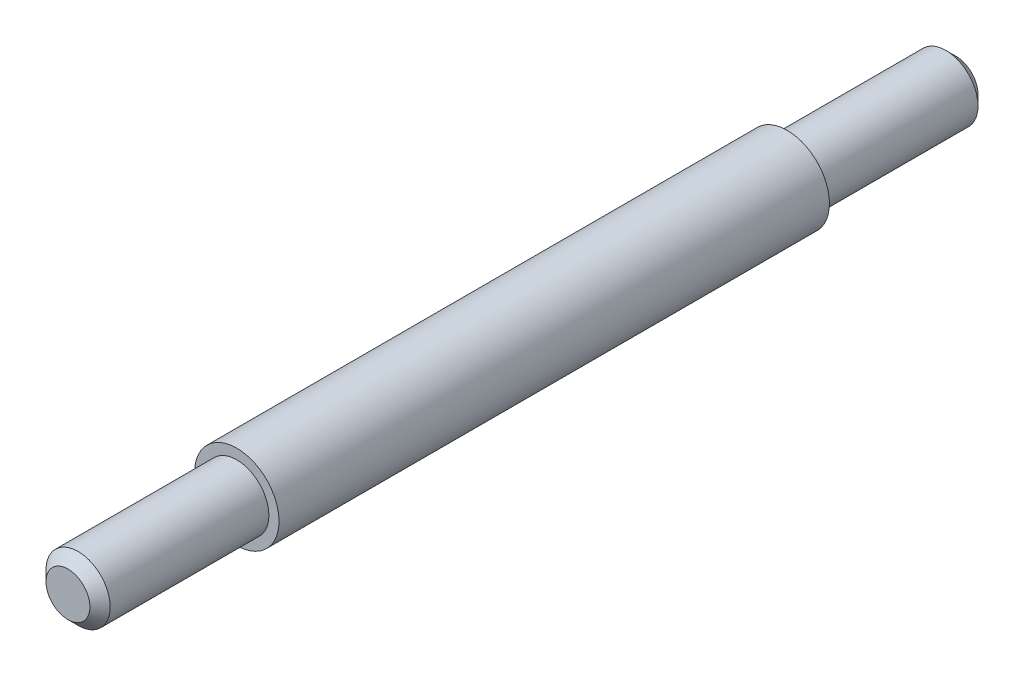
ISO-10303-21;
HEADER;
FILE_DESCRIPTION(('STEP AP214'),'2;1');
FILE_NAME('part.step','',(''),(''),'','','');
FILE_SCHEMA(('AUTOMOTIVE_DESIGN { 1 0 10303 214 1 1 1 1 }'));
ENDSEC;
DATA;
#1=APPLICATION_CONTEXT('core data for automotive mechanical design processes');
#2=APPLICATION_PROTOCOL_DEFINITION('international standard','automotive_design',2000,#1);
#3=PRODUCT_CONTEXT('',#1,'mechanical');
#4=PRODUCT('Part','Part','',(#3));
#5=PRODUCT_RELATED_PRODUCT_CATEGORY('part','',(#4));
#6=PRODUCT_DEFINITION_FORMATION('','',#4);
#7=PRODUCT_DEFINITION_CONTEXT('part definition',#1,'design');
#8=PRODUCT_DEFINITION('design','',#6,#7);
#9=PRODUCT_DEFINITION_SHAPE('','',#8);
#10=(LENGTH_UNIT() NAMED_UNIT(*) SI_UNIT(.MILLI.,.METRE.));
#11=(NAMED_UNIT(*) PLANE_ANGLE_UNIT() SI_UNIT($,.RADIAN.));
#12=(NAMED_UNIT(*) SI_UNIT($,.STERADIAN.) SOLID_ANGLE_UNIT());
#13=UNCERTAINTY_MEASURE_WITH_UNIT(LENGTH_MEASURE(1.E-05),#10,'distance_accuracy_value','');
#14=(GEOMETRIC_REPRESENTATION_CONTEXT(3) GLOBAL_UNCERTAINTY_ASSIGNED_CONTEXT((#13)) GLOBAL_UNIT_ASSIGNED_CONTEXT((#10,
#11,#12)) REPRESENTATION_CONTEXT('',''));
#15=CARTESIAN_POINT('',(0.,0.,0.));
#16=DIRECTION('',(0.,0.,1.));
#17=DIRECTION('',(1.,0.,0.));
#18=AXIS2_PLACEMENT_3D('',#15,#16,#17);
#19=CARTESIAN_POINT('',(0.,0.,1.63));
#20=DIRECTION('',(0.,0.,-1.));
#21=DIRECTION('',(-1.,0.,0.));
#22=AXIS2_PLACEMENT_3D('',#19,#20,#21);
#23=CYLINDRICAL_SURFACE('',#22,0.125);
#24=CARTESIAN_POINT('',(0.,0.,1.63));
#25=DIRECTION('',(0.,0.,1.));
#26=DIRECTION('',(1.,0.,0.));
#27=AXIS2_PLACEMENT_3D('',#24,#25,#26);
#28=CIRCLE('',#27,0.125);
#29=CARTESIAN_POINT('',(0.125,0.,1.63));
#30=VERTEX_POINT('',#29);
#31=EDGE_CURVE('E66',#30,#30,#28,.T.);
#32=ORIENTED_EDGE('',*,*,#31,.F.);
#33=EDGE_LOOP('',(#32));
#34=FACE_BOUND('',#33,.T.);
#35=CARTESIAN_POINT('',(0.,0.,0.));
#36=DIRECTION('',(0.,0.,1.));
#37=DIRECTION('',(1.,0.,0.));
#38=AXIS2_PLACEMENT_3D('',#35,#36,#37);
#39=CIRCLE('',#38,0.125);
#40=CARTESIAN_POINT('',(0.125,0.,0.));
#41=VERTEX_POINT('',#40);
#42=EDGE_CURVE('E63',#41,#41,#39,.T.);
#43=ORIENTED_EDGE('',*,*,#42,.T.);
#44=EDGE_LOOP('',(#43));
#45=FACE_BOUND('',#44,.T.);
#46=ADVANCED_FACE('F41',(#34,#45),#23,.T.);
#47=CARTESIAN_POINT('',(0.,0.,1.63));
#48=DIRECTION('',(0.,0.,1.));
#49=DIRECTION('',(1.,0.,0.));
#50=AXIS2_PLACEMENT_3D('',#47,#48,#49);
#51=PLANE('',#50);
#52=CARTESIAN_POINT('',(0.,0.,1.63));
#53=DIRECTION('',(0.,0.,1.));
#54=DIRECTION('',(1.,0.,0.));
#55=AXIS2_PLACEMENT_3D('',#52,#53,#54);
#56=CIRCLE('',#55,0.095);
#57=CARTESIAN_POINT('',(0.095,0.,1.63));
#58=VERTEX_POINT('',#57);
#59=EDGE_CURVE('E62',#58,#58,#56,.T.);
#60=ORIENTED_EDGE('',*,*,#59,.F.);
#61=EDGE_LOOP('',(#60));
#62=FACE_BOUND('',#61,.T.);
#63=ORIENTED_EDGE('',*,*,#31,.T.);
#64=EDGE_LOOP('',(#63));
#65=FACE_BOUND('',#64,.T.);
#66=ADVANCED_FACE('F77',(#62,#65),#51,.T.);
#67=CARTESIAN_POINT('',(0.,0.,0.));
#68=DIRECTION('',(0.,0.,1.));
#69=DIRECTION('',(1.,0.,0.));
#70=AXIS2_PLACEMENT_3D('',#67,#68,#69);
#71=PLANE('',#70);
#72=CARTESIAN_POINT('',(0.,0.,0.));
#73=DIRECTION('',(0.,0.,1.));
#74=DIRECTION('',(1.,0.,0.));
#75=AXIS2_PLACEMENT_3D('',#72,#73,#74);
#76=CIRCLE('',#75,0.095);
#77=CARTESIAN_POINT('',(0.095,0.,0.));
#78=VERTEX_POINT('',#77);
#79=EDGE_CURVE('E67',#78,#78,#76,.T.);
#80=ORIENTED_EDGE('',*,*,#79,.T.);
#81=EDGE_LOOP('',(#80));
#82=FACE_BOUND('',#81,.T.);
#83=ORIENTED_EDGE('',*,*,#42,.F.);
#84=EDGE_LOOP('',(#83));
#85=FACE_BOUND('',#84,.T.);
#86=ADVANCED_FACE('F80',(#82,#85),#71,.F.);
#87=CARTESIAN_POINT('',(0.,0.,-0.5));
#88=DIRECTION('',(0.,0.,1.));
#89=DIRECTION('',(1.,0.,0.));
#90=AXIS2_PLACEMENT_3D('',#87,#88,#89);
#91=CYLINDRICAL_SURFACE('',#90,0.095);
#92=CARTESIAN_POINT('',(0.,0.,-0.47));
#93=DIRECTION('',(0.,0.,1.));
#94=DIRECTION('',(1.,0.,0.));
#95=AXIS2_PLACEMENT_3D('',#92,#93,#94);
#96=CIRCLE('',#95,0.095);
#97=CARTESIAN_POINT('',(0.095,0.,-0.47));
#98=VERTEX_POINT('',#97);
#99=EDGE_CURVE('E57',#98,#98,#96,.T.);
#100=ORIENTED_EDGE('',*,*,#99,.T.);
#101=EDGE_LOOP('',(#100));
#102=FACE_BOUND('',#101,.T.);
#103=ORIENTED_EDGE('',*,*,#79,.F.);
#104=EDGE_LOOP('',(#103));
#105=FACE_BOUND('',#104,.T.);
#106=ADVANCED_FACE('F90',(#102,#105),#91,.T.);
#107=CARTESIAN_POINT('',(0.,0.,-0.5));
#108=DIRECTION('',(0.,0.,1.));
#109=DIRECTION('',(1.,0.,0.));
#110=AXIS2_PLACEMENT_3D('',#107,#108,#109);
#111=PLANE('',#110);
#112=CARTESIAN_POINT('',(0.,0.,-0.5));
#113=DIRECTION('',(0.,0.,1.));
#114=DIRECTION('',(1.,0.,0.));
#115=AXIS2_PLACEMENT_3D('',#112,#113,#114);
#116=CIRCLE('',#115,0.0650000000000002);
#117=CARTESIAN_POINT('',(0.0650000000000002,0.,-0.5));
#118=VERTEX_POINT('',#117);
#119=EDGE_CURVE('E53',#118,#118,#116,.F.);
#120=ORIENTED_EDGE('',*,*,#119,.T.);
#121=EDGE_LOOP('',(#120));
#122=FACE_BOUND('',#121,.T.);
#123=ADVANCED_FACE('F96',(#122),#111,.F.);
#124=CARTESIAN_POINT('',(0.,0.,2.13));
#125=DIRECTION('',(0.,0.,-1.));
#126=DIRECTION('',(-1.,0.,0.));
#127=AXIS2_PLACEMENT_3D('',#124,#125,#126);
#128=CYLINDRICAL_SURFACE('',#127,0.095);
#129=CARTESIAN_POINT('',(0.,0.,2.1));
#130=DIRECTION('',(0.,0.,1.));
#131=DIRECTION('',(1.,0.,0.));
#132=AXIS2_PLACEMENT_3D('',#129,#130,#131);
#133=CIRCLE('',#132,0.095);
#134=CARTESIAN_POINT('',(0.095,0.,2.1));
#135=VERTEX_POINT('',#134);
#136=EDGE_CURVE('E12',#135,#135,#133,.F.);
#137=ORIENTED_EDGE('',*,*,#136,.T.);
#138=EDGE_LOOP('',(#137));
#139=FACE_BOUND('',#138,.T.);
#140=ORIENTED_EDGE('',*,*,#59,.T.);
#141=EDGE_LOOP('',(#140));
#142=FACE_BOUND('',#141,.T.);
#143=ADVANCED_FACE('F75',(#139,#142),#128,.T.);
#144=CARTESIAN_POINT('',(0.,0.,2.13));
#145=DIRECTION('',(0.,0.,1.));
#146=DIRECTION('',(1.,0.,0.));
#147=AXIS2_PLACEMENT_3D('',#144,#145,#146);
#148=PLANE('',#147);
#149=CARTESIAN_POINT('',(0.,0.,2.13));
#150=DIRECTION('',(0.,0.,1.));
#151=DIRECTION('',(1.,0.,0.));
#152=AXIS2_PLACEMENT_3D('',#149,#150,#151);
#153=CIRCLE('',#152,0.065);
#154=CARTESIAN_POINT('',(0.065,0.,2.13));
#155=VERTEX_POINT('',#154);
#156=EDGE_CURVE('E49',#155,#155,#153,.T.);
#157=ORIENTED_EDGE('',*,*,#156,.T.);
#158=EDGE_LOOP('',(#157));
#159=FACE_BOUND('',#158,.T.);
#160=ADVANCED_FACE('F104',(#159),#148,.T.);
#161=CARTESIAN_POINT('',(0.,0.,-0.47));
#162=DIRECTION('',(0.,0.,1.));
#163=DIRECTION('',(1.,0.,0.));
#164=AXIS2_PLACEMENT_3D('',#161,#162,#163);
#165=CONICAL_SURFACE('',#164,0.095,0.785398163397451);
#166=ORIENTED_EDGE('',*,*,#119,.F.);
#167=EDGE_LOOP('',(#166));
#168=FACE_BOUND('',#167,.T.);
#169=ORIENTED_EDGE('',*,*,#99,.F.);
#170=EDGE_LOOP('',(#169));
#171=FACE_BOUND('',#170,.T.);
#172=ADVANCED_FACE('F100',(#168,#171),#165,.T.);
#173=CARTESIAN_POINT('',(0.,0.,2.13));
#174=DIRECTION('',(0.,0.,-1.));
#175=DIRECTION('',(-1.,0.,0.));
#176=AXIS2_PLACEMENT_3D('',#173,#174,#175);
#177=CONICAL_SURFACE('',#176,0.065,0.785398163397447);
#178=ORIENTED_EDGE('',*,*,#136,.F.);
#179=EDGE_LOOP('',(#178));
#180=FACE_BOUND('',#179,.T.);
#181=ORIENTED_EDGE('',*,*,#156,.F.);
#182=EDGE_LOOP('',(#181));
#183=FACE_BOUND('',#182,.T.);
#184=ADVANCED_FACE('F44',(#180,#183),#177,.T.);
#185=CLOSED_SHELL('',(#46,#66,#86,#106,#123,#143,#160,#172,#184));
#186=MANIFOLD_SOLID_BREP('B2',#185);
#187=ADVANCED_BREP_SHAPE_REPRESENTATION('',(#18,#186),#14);
#188=SHAPE_DEFINITION_REPRESENTATION(#9,#187);
ENDSEC;
END-ISO-10303-21;
